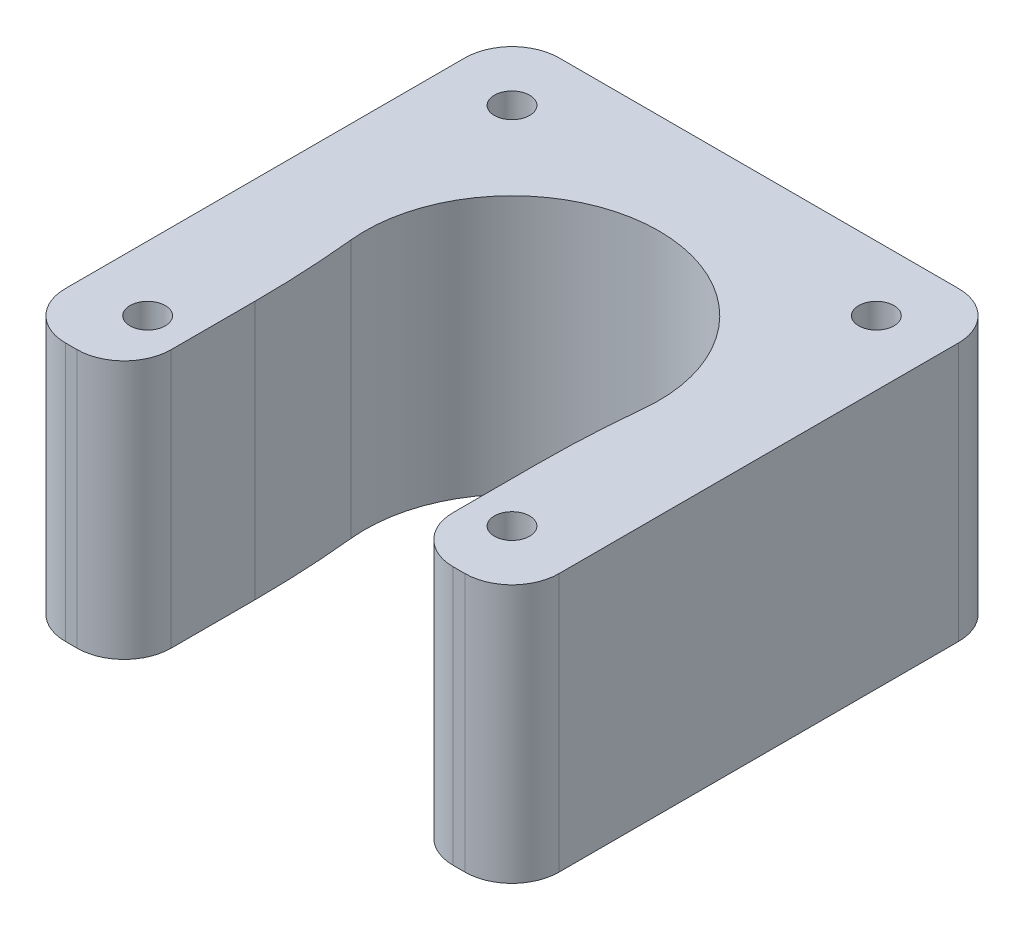
ISO-10303-21;
HEADER;
FILE_DESCRIPTION(('STEP AP214'),'2;1');
FILE_NAME('part.step','',(''),(''),'','','');
FILE_SCHEMA(('AUTOMOTIVE_DESIGN { 1 0 10303 214 1 1 1 1 }'));
ENDSEC;
DATA;
#1=APPLICATION_CONTEXT('core data for automotive mechanical design processes');
#2=APPLICATION_PROTOCOL_DEFINITION('international standard','automotive_design',2000,#1);
#3=PRODUCT_CONTEXT('',#1,'mechanical');
#4=PRODUCT('Part','Part','',(#3));
#5=PRODUCT_RELATED_PRODUCT_CATEGORY('part','',(#4));
#6=PRODUCT_DEFINITION_FORMATION('','',#4);
#7=PRODUCT_DEFINITION_CONTEXT('part definition',#1,'design');
#8=PRODUCT_DEFINITION('design','',#6,#7);
#9=PRODUCT_DEFINITION_SHAPE('','',#8);
#10=(LENGTH_UNIT() NAMED_UNIT(*) SI_UNIT(.MILLI.,.METRE.));
#11=(NAMED_UNIT(*) PLANE_ANGLE_UNIT() SI_UNIT($,.RADIAN.));
#12=(NAMED_UNIT(*) SI_UNIT($,.STERADIAN.) SOLID_ANGLE_UNIT());
#13=UNCERTAINTY_MEASURE_WITH_UNIT(LENGTH_MEASURE(1.E-05),#10,'distance_accuracy_value','');
#14=(GEOMETRIC_REPRESENTATION_CONTEXT(3) GLOBAL_UNCERTAINTY_ASSIGNED_CONTEXT((#13)) GLOBAL_UNIT_ASSIGNED_CONTEXT((#10,
#11,#12)) REPRESENTATION_CONTEXT('',''));
#15=CARTESIAN_POINT('',(0.,0.,0.));
#16=DIRECTION('',(0.,0.,1.));
#17=DIRECTION('',(1.,0.,0.));
#18=AXIS2_PLACEMENT_3D('',#15,#16,#17);
#19=CARTESIAN_POINT('',(0.,22.,0.));
#20=DIRECTION('',(0.,-1.,0.));
#21=DIRECTION('',(0.,0.,-1.));
#22=AXIS2_PLACEMENT_3D('',#19,#20,#21);
#23=CYLINDRICAL_SURFACE('',#22,12.5);
#24=CARTESIAN_POINT('',(0.,22.,0.));
#25=DIRECTION('',(0.,1.,0.));
#26=DIRECTION('',(0.,0.,1.));
#27=AXIS2_PLACEMENT_3D('',#24,#25,#26);
#28=CIRCLE('',#27,12.5);
#29=CARTESIAN_POINT('',(12.4358974358974,22.,1.26430018739205));
#30=VERTEX_POINT('',#29);
#31=CARTESIAN_POINT('',(-12.4358974358974,22.,1.26430018739205));
#32=VERTEX_POINT('',#31);
#33=EDGE_CURVE('E296',#30,#32,#28,.T.);
#34=ORIENTED_EDGE('',*,*,#33,.T.);
#35=DIRECTION('',(0.,-1.,0.));
#36=VECTOR('',#35,1.);
#37=CARTESIAN_POINT('',(-12.4358974358974,22.,1.26430018739205));
#38=LINE('',#37,#36);
#39=CARTESIAN_POINT('',(-12.4358974358974,0.,1.26430018739205));
#40=VERTEX_POINT('',#39);
#41=EDGE_CURVE('E162',#32,#40,#38,.T.);
#42=ORIENTED_EDGE('',*,*,#41,.T.);
#43=CARTESIAN_POINT('',(0.,0.,0.));
#44=DIRECTION('',(0.,1.,0.));
#45=DIRECTION('',(0.,0.,1.));
#46=AXIS2_PLACEMENT_3D('',#43,#44,#45);
#47=CIRCLE('',#46,12.5);
#48=CARTESIAN_POINT('',(12.4358974358974,0.,1.26430018739205));
#49=VERTEX_POINT('',#48);
#50=EDGE_CURVE('E154',#49,#40,#47,.T.);
#51=ORIENTED_EDGE('',*,*,#50,.F.);
#52=DIRECTION('',(0.,-1.,0.));
#53=VECTOR('',#52,1.);
#54=CARTESIAN_POINT('',(12.4358974358974,22.,1.26430018739205));
#55=LINE('',#54,#53);
#56=EDGE_CURVE('E167',#49,#30,#55,.F.);
#57=ORIENTED_EDGE('',*,*,#56,.T.);
#58=EDGE_LOOP('',(#34,#42,#51,#57));
#59=FACE_BOUND('',#58,.T.);
#60=ADVANCED_FACE('F36',(#59),#23,.F.);
#61=CARTESIAN_POINT('',(12.,22.,0.));
#62=DIRECTION('',(1.,0.,0.));
#63=DIRECTION('',(0.,0.,-1.));
#64=AXIS2_PLACEMENT_3D('',#61,#62,#63);
#65=PLANE('',#64);
#66=DIRECTION('',(0.,0.,1.));
#67=VECTOR('',#66,1.);
#68=CARTESIAN_POINT('',(12.,0.,0.));
#69=LINE('',#68,#67);
#70=CARTESIAN_POINT('',(12.,0.,9.86154146165802));
#71=VERTEX_POINT('',#70);
#72=CARTESIAN_POINT('',(12.,0.,17.));
#73=VERTEX_POINT('',#72);
#74=EDGE_CURVE('E156',#71,#73,#69,.T.);
#75=ORIENTED_EDGE('',*,*,#74,.T.);
#76=DIRECTION('',(0.,-1.,0.));
#77=VECTOR('',#76,1.);
#78=CARTESIAN_POINT('',(12.,22.,17.));
#79=LINE('',#78,#77);
#80=CARTESIAN_POINT('',(12.,22.,17.));
#81=VERTEX_POINT('',#80);
#82=EDGE_CURVE('E11',#73,#81,#79,.F.);
#83=ORIENTED_EDGE('',*,*,#82,.T.);
#84=DIRECTION('',(0.,0.,1.));
#85=VECTOR('',#84,1.);
#86=CARTESIAN_POINT('',(12.,22.,0.));
#87=LINE('',#86,#85);
#88=CARTESIAN_POINT('',(12.,22.,9.86154146165802));
#89=VERTEX_POINT('',#88);
#90=EDGE_CURVE('E259',#89,#81,#87,.T.);
#91=ORIENTED_EDGE('',*,*,#90,.F.);
#92=DIRECTION('',(0.,1.,0.));
#93=VECTOR('',#92,1.);
#94=CARTESIAN_POINT('',(12.,0.,9.86154146165802));
#95=LINE('',#94,#93);
#96=EDGE_CURVE('E191',#89,#71,#95,.F.);
#97=ORIENTED_EDGE('',*,*,#96,.T.);
#98=EDGE_LOOP('',(#75,#83,#91,#97));
#99=FACE_BOUND('',#98,.T.);
#100=ADVANCED_FACE('F318',(#99),#65,.F.);
#101=CARTESIAN_POINT('',(0.,22.,21.));
#102=DIRECTION('',(0.,0.,-1.));
#103=DIRECTION('',(-1.,0.,0.));
#104=AXIS2_PLACEMENT_3D('',#101,#102,#103);
#105=PLANE('',#104);
#106=DIRECTION('',(1.,0.,0.));
#107=VECTOR('',#106,1.);
#108=CARTESIAN_POINT('',(0.,0.,21.));
#109=LINE('',#108,#107);
#110=CARTESIAN_POINT('',(16.,0.,21.));
#111=VERTEX_POINT('',#110);
#112=CARTESIAN_POINT('',(17.,0.,21.));
#113=VERTEX_POINT('',#112);
#114=EDGE_CURVE('E249',#111,#113,#109,.T.);
#115=ORIENTED_EDGE('',*,*,#114,.T.);
#116=DIRECTION('',(0.,-1.,0.));
#117=VECTOR('',#116,1.);
#118=CARTESIAN_POINT('',(17.,22.,21.));
#119=LINE('',#118,#117);
#120=CARTESIAN_POINT('',(17.,22.,21.));
#121=VERTEX_POINT('',#120);
#122=EDGE_CURVE('E44',#113,#121,#119,.F.);
#123=ORIENTED_EDGE('',*,*,#122,.T.);
#124=DIRECTION('',(1.,0.,0.));
#125=VECTOR('',#124,1.);
#126=CARTESIAN_POINT('',(0.,22.,21.));
#127=LINE('',#126,#125);
#128=CARTESIAN_POINT('',(16.,22.,21.));
#129=VERTEX_POINT('',#128);
#130=EDGE_CURVE('E246',#129,#121,#127,.T.);
#131=ORIENTED_EDGE('',*,*,#130,.F.);
#132=DIRECTION('',(0.,-1.,0.));
#133=VECTOR('',#132,1.);
#134=CARTESIAN_POINT('',(16.,22.,21.));
#135=LINE('',#134,#133);
#136=EDGE_CURVE('E238',#129,#111,#135,.T.);
#137=ORIENTED_EDGE('',*,*,#136,.T.);
#138=EDGE_LOOP('',(#115,#123,#131,#137));
#139=FACE_BOUND('',#138,.T.);
#140=ADVANCED_FACE('F245',(#139),#105,.F.);
#141=CARTESIAN_POINT('',(21.,22.,0.));
#142=DIRECTION('',(-1.,0.,0.));
#143=DIRECTION('',(0.,0.,1.));
#144=AXIS2_PLACEMENT_3D('',#141,#142,#143);
#145=PLANE('',#144);
#146=DIRECTION('',(0.,0.,-1.));
#147=VECTOR('',#146,1.);
#148=CARTESIAN_POINT('',(21.,0.,0.));
#149=LINE('',#148,#147);
#150=CARTESIAN_POINT('',(21.,0.,17.));
#151=VERTEX_POINT('',#150);
#152=CARTESIAN_POINT('',(21.,0.,-17.));
#153=VERTEX_POINT('',#152);
#154=EDGE_CURVE('E267',#151,#153,#149,.T.);
#155=ORIENTED_EDGE('',*,*,#154,.T.);
#156=DIRECTION('',(0.,-1.,0.));
#157=VECTOR('',#156,1.);
#158=CARTESIAN_POINT('',(21.,22.,-17.));
#159=LINE('',#158,#157);
#160=CARTESIAN_POINT('',(21.,22.,-17.));
#161=VERTEX_POINT('',#160);
#162=EDGE_CURVE('E229',#153,#161,#159,.F.);
#163=ORIENTED_EDGE('',*,*,#162,.T.);
#164=DIRECTION('',(0.,0.,-1.));
#165=VECTOR('',#164,1.);
#166=CARTESIAN_POINT('',(21.,22.,0.));
#167=LINE('',#166,#165);
#168=CARTESIAN_POINT('',(21.,22.,17.));
#169=VERTEX_POINT('',#168);
#170=EDGE_CURVE('E258',#169,#161,#167,.T.);
#171=ORIENTED_EDGE('',*,*,#170,.F.);
#172=DIRECTION('',(0.,-1.,0.));
#173=VECTOR('',#172,1.);
#174=CARTESIAN_POINT('',(21.,22.,17.));
#175=LINE('',#174,#173);
#176=EDGE_CURVE('E226',#169,#151,#175,.T.);
#177=ORIENTED_EDGE('',*,*,#176,.T.);
#178=EDGE_LOOP('',(#155,#163,#171,#177));
#179=FACE_BOUND('',#178,.T.);
#180=ADVANCED_FACE('F266',(#179),#145,.F.);
#181=CARTESIAN_POINT('',(0.,22.,-21.));
#182=DIRECTION('',(0.,0.,-1.));
#183=DIRECTION('',(-1.,0.,0.));
#184=AXIS2_PLACEMENT_3D('',#181,#182,#183);
#185=PLANE('',#184);
#186=DIRECTION('',(1.,0.,0.));
#187=VECTOR('',#186,1.);
#188=CARTESIAN_POINT('',(0.,0.,-21.));
#189=LINE('',#188,#187);
#190=CARTESIAN_POINT('',(-17.,0.,-21.));
#191=VERTEX_POINT('',#190);
#192=CARTESIAN_POINT('',(17.,0.,-21.));
#193=VERTEX_POINT('',#192);
#194=EDGE_CURVE('E270',#191,#193,#189,.T.);
#195=ORIENTED_EDGE('',*,*,#194,.F.);
#196=DIRECTION('',(0.,-1.,0.));
#197=VECTOR('',#196,1.);
#198=CARTESIAN_POINT('',(-17.,22.,-21.));
#199=LINE('',#198,#197);
#200=CARTESIAN_POINT('',(-17.,22.,-21.));
#201=VERTEX_POINT('',#200);
#202=EDGE_CURVE('E213',#191,#201,#199,.F.);
#203=ORIENTED_EDGE('',*,*,#202,.T.);
#204=DIRECTION('',(1.,0.,0.));
#205=VECTOR('',#204,1.);
#206=CARTESIAN_POINT('',(0.,22.,-21.));
#207=LINE('',#206,#205);
#208=CARTESIAN_POINT('',(17.,22.,-21.));
#209=VERTEX_POINT('',#208);
#210=EDGE_CURVE('E301',#201,#209,#207,.T.);
#211=ORIENTED_EDGE('',*,*,#210,.T.);
#212=DIRECTION('',(0.,-1.,0.));
#213=VECTOR('',#212,1.);
#214=CARTESIAN_POINT('',(17.,0.,-21.));
#215=LINE('',#214,#213);
#216=EDGE_CURVE('E210',#209,#193,#215,.T.);
#217=ORIENTED_EDGE('',*,*,#216,.T.);
#218=EDGE_LOOP('',(#195,#203,#211,#217));
#219=FACE_BOUND('',#218,.T.);
#220=ADVANCED_FACE('F393',(#219),#185,.T.);
#221=CARTESIAN_POINT('',(-21.,22.,0.));
#222=DIRECTION('',(-1.,0.,0.));
#223=DIRECTION('',(0.,0.,1.));
#224=AXIS2_PLACEMENT_3D('',#221,#222,#223);
#225=PLANE('',#224);
#226=DIRECTION('',(0.,0.,-1.));
#227=VECTOR('',#226,1.);
#228=CARTESIAN_POINT('',(-21.,22.,0.));
#229=LINE('',#228,#227);
#230=CARTESIAN_POINT('',(-21.,22.,17.));
#231=VERTEX_POINT('',#230);
#232=CARTESIAN_POINT('',(-21.,22.,-17.));
#233=VERTEX_POINT('',#232);
#234=EDGE_CURVE('E299',#231,#233,#229,.T.);
#235=ORIENTED_EDGE('',*,*,#234,.T.);
#236=DIRECTION('',(0.,-1.,0.));
#237=VECTOR('',#236,1.);
#238=CARTESIAN_POINT('',(-21.,22.,-17.));
#239=LINE('',#238,#237);
#240=CARTESIAN_POINT('',(-21.,0.,-17.));
#241=VERTEX_POINT('',#240);
#242=EDGE_CURVE('E195',#233,#241,#239,.T.);
#243=ORIENTED_EDGE('',*,*,#242,.T.);
#244=DIRECTION('',(0.,0.,-1.));
#245=VECTOR('',#244,1.);
#246=CARTESIAN_POINT('',(-21.,0.,0.));
#247=LINE('',#246,#245);
#248=CARTESIAN_POINT('',(-21.,0.,17.));
#249=VERTEX_POINT('',#248);
#250=EDGE_CURVE('E272',#249,#241,#247,.T.);
#251=ORIENTED_EDGE('',*,*,#250,.F.);
#252=DIRECTION('',(0.,-1.,0.));
#253=VECTOR('',#252,1.);
#254=CARTESIAN_POINT('',(-21.,22.,17.));
#255=LINE('',#254,#253);
#256=EDGE_CURVE('E193',#249,#231,#255,.F.);
#257=ORIENTED_EDGE('',*,*,#256,.T.);
#258=EDGE_LOOP('',(#235,#243,#251,#257));
#259=FACE_BOUND('',#258,.T.);
#260=ADVANCED_FACE('F390',(#259),#225,.T.);
#261=CARTESIAN_POINT('',(-17.,22.,21.));
#262=VERTEX_POINT('',#261);
#263=CARTESIAN_POINT('',(-16.,22.,21.));
#264=VERTEX_POINT('',#263);
#265=EDGE_CURVE('E179',#262,#264,#127,.T.);
#266=ORIENTED_EDGE('',*,*,#265,.F.);
#267=DIRECTION('',(0.,-1.,0.));
#268=VECTOR('',#267,1.);
#269=CARTESIAN_POINT('',(-17.,0.,21.));
#270=LINE('',#269,#268);
#271=CARTESIAN_POINT('',(-17.,0.,21.));
#272=VERTEX_POINT('',#271);
#273=EDGE_CURVE('E232',#262,#272,#270,.T.);
#274=ORIENTED_EDGE('',*,*,#273,.T.);
#275=CARTESIAN_POINT('',(-16.,0.,21.));
#276=VERTEX_POINT('',#275);
#277=EDGE_CURVE('E275',#272,#276,#109,.T.);
#278=ORIENTED_EDGE('',*,*,#277,.T.);
#279=DIRECTION('',(0.,-1.,0.));
#280=VECTOR('',#279,1.);
#281=CARTESIAN_POINT('',(-16.,22.,21.));
#282=LINE('',#281,#280);
#283=EDGE_CURVE('E51',#276,#264,#282,.F.);
#284=ORIENTED_EDGE('',*,*,#283,.T.);
#285=EDGE_LOOP('',(#266,#274,#278,#284));
#286=FACE_BOUND('',#285,.T.);
#287=ADVANCED_FACE('F338',(#286),#105,.F.);
#288=CARTESIAN_POINT('',(15.5,22.,15.5));
#289=DIRECTION('',(0.,-1.,0.));
#290=DIRECTION('',(0.,0.,-1.));
#291=AXIS2_PLACEMENT_3D('',#288,#289,#290);
#292=CYLINDRICAL_SURFACE('',#291,1.5);
#293=CARTESIAN_POINT('',(15.5,22.,15.5));
#294=DIRECTION('',(0.,1.,0.));
#295=DIRECTION('',(0.,0.,1.));
#296=AXIS2_PLACEMENT_3D('',#293,#294,#295);
#297=CIRCLE('',#296,1.5);
#298=CARTESIAN_POINT('',(15.5,22.,17.));
#299=VERTEX_POINT('',#298);
#300=EDGE_CURVE('E293',#299,#299,#297,.T.);
#301=ORIENTED_EDGE('',*,*,#300,.T.);
#302=EDGE_LOOP('',(#301));
#303=FACE_BOUND('',#302,.T.);
#304=CARTESIAN_POINT('',(15.5,0.,15.5));
#305=DIRECTION('',(0.,1.,0.));
#306=DIRECTION('',(0.,0.,1.));
#307=AXIS2_PLACEMENT_3D('',#304,#305,#306);
#308=CIRCLE('',#307,1.5);
#309=CARTESIAN_POINT('',(15.5,0.,17.));
#310=VERTEX_POINT('',#309);
#311=EDGE_CURVE('E170',#310,#310,#308,.T.);
#312=ORIENTED_EDGE('',*,*,#311,.F.);
#313=EDGE_LOOP('',(#312));
#314=FACE_BOUND('',#313,.T.);
#315=ADVANCED_FACE('F334',(#303,#314),#292,.F.);
#316=CARTESIAN_POINT('',(-15.5,22.,15.5));
#317=DIRECTION('',(0.,-1.,0.));
#318=DIRECTION('',(0.,0.,-1.));
#319=AXIS2_PLACEMENT_3D('',#316,#317,#318);
#320=CYLINDRICAL_SURFACE('',#319,1.5);
#321=CARTESIAN_POINT('',(-15.5,22.,15.5));
#322=DIRECTION('',(0.,1.,0.));
#323=DIRECTION('',(0.,0.,1.));
#324=AXIS2_PLACEMENT_3D('',#321,#322,#323);
#325=CIRCLE('',#324,1.5);
#326=CARTESIAN_POINT('',(-15.5,22.,17.));
#327=VERTEX_POINT('',#326);
#328=EDGE_CURVE('E288',#327,#327,#325,.T.);
#329=ORIENTED_EDGE('',*,*,#328,.T.);
#330=EDGE_LOOP('',(#329));
#331=FACE_BOUND('',#330,.T.);
#332=CARTESIAN_POINT('',(-15.5,0.,15.5));
#333=DIRECTION('',(0.,1.,0.));
#334=DIRECTION('',(0.,0.,1.));
#335=AXIS2_PLACEMENT_3D('',#332,#333,#334);
#336=CIRCLE('',#335,1.5);
#337=CARTESIAN_POINT('',(-15.5,0.,17.));
#338=VERTEX_POINT('',#337);
#339=EDGE_CURVE('E312',#338,#338,#336,.T.);
#340=ORIENTED_EDGE('',*,*,#339,.F.);
#341=EDGE_LOOP('',(#340));
#342=FACE_BOUND('',#341,.T.);
#343=ADVANCED_FACE('F337',(#331,#342),#320,.F.);
#344=CARTESIAN_POINT('',(15.5,22.,-15.5));
#345=DIRECTION('',(0.,-1.,0.));
#346=DIRECTION('',(0.,0.,-1.));
#347=AXIS2_PLACEMENT_3D('',#344,#345,#346);
#348=CYLINDRICAL_SURFACE('',#347,1.5);
#349=CARTESIAN_POINT('',(15.5,22.,-15.5));
#350=DIRECTION('',(0.,1.,0.));
#351=DIRECTION('',(0.,0.,1.));
#352=AXIS2_PLACEMENT_3D('',#349,#350,#351);
#353=CIRCLE('',#352,1.5);
#354=CARTESIAN_POINT('',(15.5,22.,-14.));
#355=VERTEX_POINT('',#354);
#356=EDGE_CURVE('E283',#355,#355,#353,.T.);
#357=ORIENTED_EDGE('',*,*,#356,.T.);
#358=EDGE_LOOP('',(#357));
#359=FACE_BOUND('',#358,.T.);
#360=CARTESIAN_POINT('',(15.5,0.,-15.5));
#361=DIRECTION('',(0.,1.,0.));
#362=DIRECTION('',(0.,0.,1.));
#363=AXIS2_PLACEMENT_3D('',#360,#361,#362);
#364=CIRCLE('',#363,1.5);
#365=CARTESIAN_POINT('',(15.5,0.,-14.));
#366=VERTEX_POINT('',#365);
#367=EDGE_CURVE('E309',#366,#366,#364,.T.);
#368=ORIENTED_EDGE('',*,*,#367,.F.);
#369=EDGE_LOOP('',(#368));
#370=FACE_BOUND('',#369,.T.);
#371=ADVANCED_FACE('F342',(#359,#370),#348,.F.);
#372=CARTESIAN_POINT('',(-15.5,22.,-15.5));
#373=DIRECTION('',(0.,-1.,0.));
#374=DIRECTION('',(0.,0.,-1.));
#375=AXIS2_PLACEMENT_3D('',#372,#373,#374);
#376=CYLINDRICAL_SURFACE('',#375,1.5);
#377=CARTESIAN_POINT('',(-15.5,22.,-15.5));
#378=DIRECTION('',(0.,1.,0.));
#379=DIRECTION('',(0.,0.,1.));
#380=AXIS2_PLACEMENT_3D('',#377,#378,#379);
#381=CIRCLE('',#380,1.5);
#382=CARTESIAN_POINT('',(-15.5,22.,-14.));
#383=VERTEX_POINT('',#382);
#384=EDGE_CURVE('E280',#383,#383,#381,.T.);
#385=ORIENTED_EDGE('',*,*,#384,.T.);
#386=EDGE_LOOP('',(#385));
#387=FACE_BOUND('',#386,.T.);
#388=CARTESIAN_POINT('',(-15.5,0.,-15.5));
#389=DIRECTION('',(0.,1.,0.));
#390=DIRECTION('',(0.,0.,1.));
#391=AXIS2_PLACEMENT_3D('',#388,#389,#390);
#392=CIRCLE('',#391,1.5);
#393=CARTESIAN_POINT('',(-15.5,0.,-14.));
#394=VERTEX_POINT('',#393);
#395=EDGE_CURVE('E306',#394,#394,#392,.T.);
#396=ORIENTED_EDGE('',*,*,#395,.F.);
#397=EDGE_LOOP('',(#396));
#398=FACE_BOUND('',#397,.T.);
#399=ADVANCED_FACE('F346',(#387,#398),#376,.F.);
#400=CARTESIAN_POINT('',(-12.,22.,0.));
#401=DIRECTION('',(1.,0.,0.));
#402=DIRECTION('',(0.,0.,-1.));
#403=AXIS2_PLACEMENT_3D('',#400,#401,#402);
#404=PLANE('',#403);
#405=DIRECTION('',(0.,0.,1.));
#406=VECTOR('',#405,1.);
#407=CARTESIAN_POINT('',(-12.,22.,0.));
#408=LINE('',#407,#406);
#409=CARTESIAN_POINT('',(-12.,22.,9.86154146165802));
#410=VERTEX_POINT('',#409);
#411=CARTESIAN_POINT('',(-12.,22.,17.));
#412=VERTEX_POINT('',#411);
#413=EDGE_CURVE('E175',#410,#412,#408,.T.);
#414=ORIENTED_EDGE('',*,*,#413,.T.);
#415=DIRECTION('',(0.,-1.,0.));
#416=VECTOR('',#415,1.);
#417=CARTESIAN_POINT('',(-12.,0.,17.));
#418=LINE('',#417,#416);
#419=CARTESIAN_POINT('',(-12.,0.,17.));
#420=VERTEX_POINT('',#419);
#421=EDGE_CURVE('E235',#412,#420,#418,.T.);
#422=ORIENTED_EDGE('',*,*,#421,.T.);
#423=DIRECTION('',(0.,0.,1.));
#424=VECTOR('',#423,1.);
#425=CARTESIAN_POINT('',(-12.,0.,0.));
#426=LINE('',#425,#424);
#427=CARTESIAN_POINT('',(-12.,0.,9.86154146165802));
#428=VERTEX_POINT('',#427);
#429=EDGE_CURVE('E182',#428,#420,#426,.T.);
#430=ORIENTED_EDGE('',*,*,#429,.F.);
#431=DIRECTION('',(0.,-1.,0.));
#432=VECTOR('',#431,1.);
#433=CARTESIAN_POINT('',(-12.,22.,9.86154146165802));
#434=LINE('',#433,#432);
#435=EDGE_CURVE('E186',#428,#410,#434,.F.);
#436=ORIENTED_EDGE('',*,*,#435,.T.);
#437=EDGE_LOOP('',(#414,#422,#430,#436));
#438=FACE_BOUND('',#437,.T.);
#439=ADVANCED_FACE('F350',(#438),#404,.T.);
#440=CARTESIAN_POINT('',(0.,22.,0.));
#441=DIRECTION('',(0.,1.,0.));
#442=DIRECTION('',(0.,0.,1.));
#443=AXIS2_PLACEMENT_3D('',#440,#441,#442);
#444=PLANE('',#443);
#445=ORIENTED_EDGE('',*,*,#384,.F.);
#446=EDGE_LOOP('',(#445));
#447=FACE_BOUND('',#446,.T.);
#448=ORIENTED_EDGE('',*,*,#356,.F.);
#449=EDGE_LOOP('',(#448));
#450=FACE_BOUND('',#449,.T.);
#451=ORIENTED_EDGE('',*,*,#328,.F.);
#452=EDGE_LOOP('',(#451));
#453=FACE_BOUND('',#452,.T.);
#454=ORIENTED_EDGE('',*,*,#300,.F.);
#455=EDGE_LOOP('',(#454));
#456=FACE_BOUND('',#455,.T.);
#457=ORIENTED_EDGE('',*,*,#210,.F.);
#458=CARTESIAN_POINT('',(-17.,22.,-17.));
#459=DIRECTION('',(0.,1.,0.));
#460=DIRECTION('',(0.,0.,1.));
#461=AXIS2_PLACEMENT_3D('',#458,#459,#460);
#462=CIRCLE('',#461,4.);
#463=EDGE_CURVE('E224',#201,#233,#462,.T.);
#464=ORIENTED_EDGE('',*,*,#463,.T.);
#465=ORIENTED_EDGE('',*,*,#234,.F.);
#466=CARTESIAN_POINT('',(-17.,22.,17.));
#467=DIRECTION('',(0.,1.,0.));
#468=DIRECTION('',(0.,0.,1.));
#469=AXIS2_PLACEMENT_3D('',#466,#467,#468);
#470=CIRCLE('',#469,4.);
#471=EDGE_CURVE('E58',#231,#262,#470,.T.);
#472=ORIENTED_EDGE('',*,*,#471,.T.);
#473=ORIENTED_EDGE('',*,*,#265,.T.);
#474=CARTESIAN_POINT('',(-16.,22.,17.));
#475=DIRECTION('',(0.,1.,0.));
#476=DIRECTION('',(0.,0.,1.));
#477=AXIS2_PLACEMENT_3D('',#474,#475,#476);
#478=CIRCLE('',#477,4.);
#479=EDGE_CURVE('E219',#264,#412,#478,.T.);
#480=ORIENTED_EDGE('',*,*,#479,.T.);
#481=ORIENTED_EDGE('',*,*,#413,.F.);
#482=CARTESIAN_POINT('',(-97.,22.,9.86154146165802));
#483=DIRECTION('',(0.,1.,0.));
#484=DIRECTION('',(0.,0.,1.));
#485=AXIS2_PLACEMENT_3D('',#482,#483,#484);
#486=CIRCLE('',#485,85.);
#487=EDGE_CURVE('E189',#410,#32,#486,.T.);
#488=ORIENTED_EDGE('',*,*,#487,.T.);
#489=ORIENTED_EDGE('',*,*,#33,.F.);
#490=CARTESIAN_POINT('',(97.,22.,9.86154146165802));
#491=DIRECTION('',(0.,1.,0.));
#492=DIRECTION('',(0.,0.,1.));
#493=AXIS2_PLACEMENT_3D('',#490,#491,#492);
#494=CIRCLE('',#493,85.);
#495=EDGE_CURVE('E174',#30,#89,#494,.T.);
#496=ORIENTED_EDGE('',*,*,#495,.T.);
#497=ORIENTED_EDGE('',*,*,#90,.T.);
#498=CARTESIAN_POINT('',(16.,22.,17.));
#499=DIRECTION('',(0.,1.,0.));
#500=DIRECTION('',(0.,0.,1.));
#501=AXIS2_PLACEMENT_3D('',#498,#499,#500);
#502=CIRCLE('',#501,4.);
#503=EDGE_CURVE('E215',#81,#129,#502,.T.);
#504=ORIENTED_EDGE('',*,*,#503,.T.);
#505=ORIENTED_EDGE('',*,*,#130,.T.);
#506=CARTESIAN_POINT('',(17.,22.,17.));
#507=DIRECTION('',(0.,1.,0.));
#508=DIRECTION('',(0.,0.,1.));
#509=AXIS2_PLACEMENT_3D('',#506,#507,#508);
#510=CIRCLE('',#509,4.);
#511=EDGE_CURVE('E217',#121,#169,#510,.T.);
#512=ORIENTED_EDGE('',*,*,#511,.T.);
#513=ORIENTED_EDGE('',*,*,#170,.T.);
#514=CARTESIAN_POINT('',(17.,22.,-17.));
#515=DIRECTION('',(0.,1.,0.));
#516=DIRECTION('',(0.,0.,1.));
#517=AXIS2_PLACEMENT_3D('',#514,#515,#516);
#518=CIRCLE('',#517,4.);
#519=EDGE_CURVE('E222',#161,#209,#518,.T.);
#520=ORIENTED_EDGE('',*,*,#519,.T.);
#521=EDGE_LOOP('',(#457,#464,#465,#472,#473,#480,#481,#488,#489,#496,#497,#504,#505,#512,#513,#520));
#522=FACE_BOUND('',#521,.T.);
#523=ADVANCED_FACE('F253',(#447,#450,#453,#456,#522),#444,.T.);
#524=CARTESIAN_POINT('',(0.,0.,0.));
#525=DIRECTION('',(0.,1.,0.));
#526=DIRECTION('',(0.,0.,1.));
#527=AXIS2_PLACEMENT_3D('',#524,#525,#526);
#528=PLANE('',#527);
#529=ORIENTED_EDGE('',*,*,#395,.T.);
#530=EDGE_LOOP('',(#529));
#531=FACE_BOUND('',#530,.T.);
#532=ORIENTED_EDGE('',*,*,#367,.T.);
#533=EDGE_LOOP('',(#532));
#534=FACE_BOUND('',#533,.T.);
#535=ORIENTED_EDGE('',*,*,#339,.T.);
#536=EDGE_LOOP('',(#535));
#537=FACE_BOUND('',#536,.T.);
#538=ORIENTED_EDGE('',*,*,#311,.T.);
#539=EDGE_LOOP('',(#538));
#540=FACE_BOUND('',#539,.T.);
#541=ORIENTED_EDGE('',*,*,#250,.T.);
#542=CARTESIAN_POINT('',(-17.,0.,-17.));
#543=DIRECTION('',(0.,1.,0.));
#544=DIRECTION('',(0.,0.,1.));
#545=AXIS2_PLACEMENT_3D('',#542,#543,#544);
#546=CIRCLE('',#545,4.);
#547=EDGE_CURVE('E208',#241,#191,#546,.F.);
#548=ORIENTED_EDGE('',*,*,#547,.T.);
#549=ORIENTED_EDGE('',*,*,#194,.T.);
#550=CARTESIAN_POINT('',(17.,0.,-17.));
#551=DIRECTION('',(0.,1.,0.));
#552=DIRECTION('',(0.,0.,1.));
#553=AXIS2_PLACEMENT_3D('',#550,#551,#552);
#554=CIRCLE('',#553,4.);
#555=EDGE_CURVE('E206',#193,#153,#554,.F.);
#556=ORIENTED_EDGE('',*,*,#555,.T.);
#557=ORIENTED_EDGE('',*,*,#154,.F.);
#558=CARTESIAN_POINT('',(17.,0.,17.));
#559=DIRECTION('',(0.,1.,0.));
#560=DIRECTION('',(0.,0.,1.));
#561=AXIS2_PLACEMENT_3D('',#558,#559,#560);
#562=CIRCLE('',#561,4.);
#563=EDGE_CURVE('E200',#151,#113,#562,.F.);
#564=ORIENTED_EDGE('',*,*,#563,.T.);
#565=ORIENTED_EDGE('',*,*,#114,.F.);
#566=CARTESIAN_POINT('',(16.,0.,17.));
#567=DIRECTION('',(0.,1.,0.));
#568=DIRECTION('',(0.,0.,1.));
#569=AXIS2_PLACEMENT_3D('',#566,#567,#568);
#570=CIRCLE('',#569,4.);
#571=EDGE_CURVE('E198',#111,#73,#570,.F.);
#572=ORIENTED_EDGE('',*,*,#571,.T.);
#573=ORIENTED_EDGE('',*,*,#74,.F.);
#574=CARTESIAN_POINT('',(97.,0.,9.86154146165802));
#575=DIRECTION('',(0.,1.,0.));
#576=DIRECTION('',(0.,0.,1.));
#577=AXIS2_PLACEMENT_3D('',#574,#575,#576);
#578=CIRCLE('',#577,85.);
#579=EDGE_CURVE('E150',#71,#49,#578,.F.);
#580=ORIENTED_EDGE('',*,*,#579,.T.);
#581=ORIENTED_EDGE('',*,*,#50,.T.);
#582=CARTESIAN_POINT('',(-97.,0.,9.86154146165802));
#583=DIRECTION('',(0.,1.,0.));
#584=DIRECTION('',(0.,0.,1.));
#585=AXIS2_PLACEMENT_3D('',#582,#583,#584);
#586=CIRCLE('',#585,85.);
#587=EDGE_CURVE('E161',#40,#428,#586,.F.);
#588=ORIENTED_EDGE('',*,*,#587,.T.);
#589=ORIENTED_EDGE('',*,*,#429,.T.);
#590=CARTESIAN_POINT('',(-16.,0.,17.));
#591=DIRECTION('',(0.,1.,0.));
#592=DIRECTION('',(0.,0.,1.));
#593=AXIS2_PLACEMENT_3D('',#590,#591,#592);
#594=CIRCLE('',#593,4.);
#595=EDGE_CURVE('E202',#420,#276,#594,.F.);
#596=ORIENTED_EDGE('',*,*,#595,.T.);
#597=ORIENTED_EDGE('',*,*,#277,.F.);
#598=CARTESIAN_POINT('',(-17.,0.,17.));
#599=DIRECTION('',(0.,1.,0.));
#600=DIRECTION('',(0.,0.,1.));
#601=AXIS2_PLACEMENT_3D('',#598,#599,#600);
#602=CIRCLE('',#601,4.);
#603=EDGE_CURVE('E204',#272,#249,#602,.F.);
#604=ORIENTED_EDGE('',*,*,#603,.T.);
#605=EDGE_LOOP('',(#541,#548,#549,#556,#557,#564,#565,#572,#573,#580,#581,#588,#589,#596,#597,#604));
#606=FACE_BOUND('',#605,.T.);
#607=ADVANCED_FACE('F153',(#531,#534,#537,#540,#606),#528,.F.);
#608=CARTESIAN_POINT('',(-97.,22.,9.86154146165802));
#609=DIRECTION('',(0.,-1.,0.));
#610=DIRECTION('',(0.,0.,-1.));
#611=AXIS2_PLACEMENT_3D('',#608,#609,#610);
#612=CYLINDRICAL_SURFACE('',#611,85.);
#613=ORIENTED_EDGE('',*,*,#487,.F.);
#614=ORIENTED_EDGE('',*,*,#435,.F.);
#615=ORIENTED_EDGE('',*,*,#587,.F.);
#616=ORIENTED_EDGE('',*,*,#41,.F.);
#617=EDGE_LOOP('',(#613,#614,#615,#616));
#618=FACE_BOUND('',#617,.T.);
#619=ADVANCED_FACE('F351',(#618),#612,.T.);
#620=CARTESIAN_POINT('',(97.,22.,9.86154146165802));
#621=DIRECTION('',(0.,-1.,0.));
#622=DIRECTION('',(0.,0.,-1.));
#623=AXIS2_PLACEMENT_3D('',#620,#621,#622);
#624=CYLINDRICAL_SURFACE('',#623,85.);
#625=ORIENTED_EDGE('',*,*,#495,.F.);
#626=ORIENTED_EDGE('',*,*,#56,.F.);
#627=ORIENTED_EDGE('',*,*,#579,.F.);
#628=ORIENTED_EDGE('',*,*,#96,.F.);
#629=EDGE_LOOP('',(#625,#626,#627,#628));
#630=FACE_BOUND('',#629,.T.);
#631=ADVANCED_FACE('F173',(#630),#624,.T.);
#632=CARTESIAN_POINT('',(-17.,22.,-17.));
#633=DIRECTION('',(0.,-1.,0.));
#634=DIRECTION('',(0.,0.,-1.));
#635=AXIS2_PLACEMENT_3D('',#632,#633,#634);
#636=CYLINDRICAL_SURFACE('',#635,4.);
#637=ORIENTED_EDGE('',*,*,#463,.F.);
#638=ORIENTED_EDGE('',*,*,#202,.F.);
#639=ORIENTED_EDGE('',*,*,#547,.F.);
#640=ORIENTED_EDGE('',*,*,#242,.F.);
#641=EDGE_LOOP('',(#637,#638,#639,#640));
#642=FACE_BOUND('',#641,.T.);
#643=ADVANCED_FACE('F357',(#642),#636,.T.);
#644=CARTESIAN_POINT('',(17.,22.,-17.));
#645=DIRECTION('',(0.,1.,0.));
#646=DIRECTION('',(0.,0.,1.));
#647=AXIS2_PLACEMENT_3D('',#644,#645,#646);
#648=CYLINDRICAL_SURFACE('',#647,4.);
#649=ORIENTED_EDGE('',*,*,#519,.F.);
#650=ORIENTED_EDGE('',*,*,#162,.F.);
#651=ORIENTED_EDGE('',*,*,#555,.F.);
#652=ORIENTED_EDGE('',*,*,#216,.F.);
#653=EDGE_LOOP('',(#649,#650,#651,#652));
#654=FACE_BOUND('',#653,.T.);
#655=ADVANCED_FACE('F360',(#654),#648,.T.);
#656=CARTESIAN_POINT('',(-17.,22.,17.));
#657=DIRECTION('',(0.,1.,0.));
#658=DIRECTION('',(0.,0.,1.));
#659=AXIS2_PLACEMENT_3D('',#656,#657,#658);
#660=CYLINDRICAL_SURFACE('',#659,4.);
#661=ORIENTED_EDGE('',*,*,#471,.F.);
#662=ORIENTED_EDGE('',*,*,#256,.F.);
#663=ORIENTED_EDGE('',*,*,#603,.F.);
#664=ORIENTED_EDGE('',*,*,#273,.F.);
#665=EDGE_LOOP('',(#661,#662,#663,#664));
#666=FACE_BOUND('',#665,.T.);
#667=ADVANCED_FACE('F364',(#666),#660,.T.);
#668=CARTESIAN_POINT('',(-16.,22.,17.));
#669=DIRECTION('',(0.,1.,0.));
#670=DIRECTION('',(0.,0.,1.));
#671=AXIS2_PLACEMENT_3D('',#668,#669,#670);
#672=CYLINDRICAL_SURFACE('',#671,4.);
#673=ORIENTED_EDGE('',*,*,#479,.F.);
#674=ORIENTED_EDGE('',*,*,#283,.F.);
#675=ORIENTED_EDGE('',*,*,#595,.F.);
#676=ORIENTED_EDGE('',*,*,#421,.F.);
#677=EDGE_LOOP('',(#673,#674,#675,#676));
#678=FACE_BOUND('',#677,.T.);
#679=ADVANCED_FACE('F325',(#678),#672,.T.);
#680=CARTESIAN_POINT('',(17.,22.,17.));
#681=DIRECTION('',(0.,-1.,0.));
#682=DIRECTION('',(0.,0.,-1.));
#683=AXIS2_PLACEMENT_3D('',#680,#681,#682);
#684=CYLINDRICAL_SURFACE('',#683,4.);
#685=ORIENTED_EDGE('',*,*,#511,.F.);
#686=ORIENTED_EDGE('',*,*,#122,.F.);
#687=ORIENTED_EDGE('',*,*,#563,.F.);
#688=ORIENTED_EDGE('',*,*,#176,.F.);
#689=EDGE_LOOP('',(#685,#686,#687,#688));
#690=FACE_BOUND('',#689,.T.);
#691=ADVANCED_FACE('F262',(#690),#684,.T.);
#692=CARTESIAN_POINT('',(16.,22.,17.));
#693=DIRECTION('',(0.,-1.,0.));
#694=DIRECTION('',(0.,0.,-1.));
#695=AXIS2_PLACEMENT_3D('',#692,#693,#694);
#696=CYLINDRICAL_SURFACE('',#695,4.);
#697=ORIENTED_EDGE('',*,*,#503,.F.);
#698=ORIENTED_EDGE('',*,*,#82,.F.);
#699=ORIENTED_EDGE('',*,*,#571,.F.);
#700=ORIENTED_EDGE('',*,*,#136,.F.);
#701=EDGE_LOOP('',(#697,#698,#699,#700));
#702=FACE_BOUND('',#701,.T.);
#703=ADVANCED_FACE('F38',(#702),#696,.T.);
#704=CLOSED_SHELL('',(#60,#100,#140,#180,#220,#260,#287,#315,#343,#371,#399,#439,#523,#607,#619,
#631,#643,#655,#667,#679,#691,#703));
#705=MANIFOLD_SOLID_BREP('B2',#704);
#706=ADVANCED_BREP_SHAPE_REPRESENTATION('',(#18,#705),#14);
#707=SHAPE_DEFINITION_REPRESENTATION(#9,#706);
ENDSEC;
END-ISO-10303-21;
